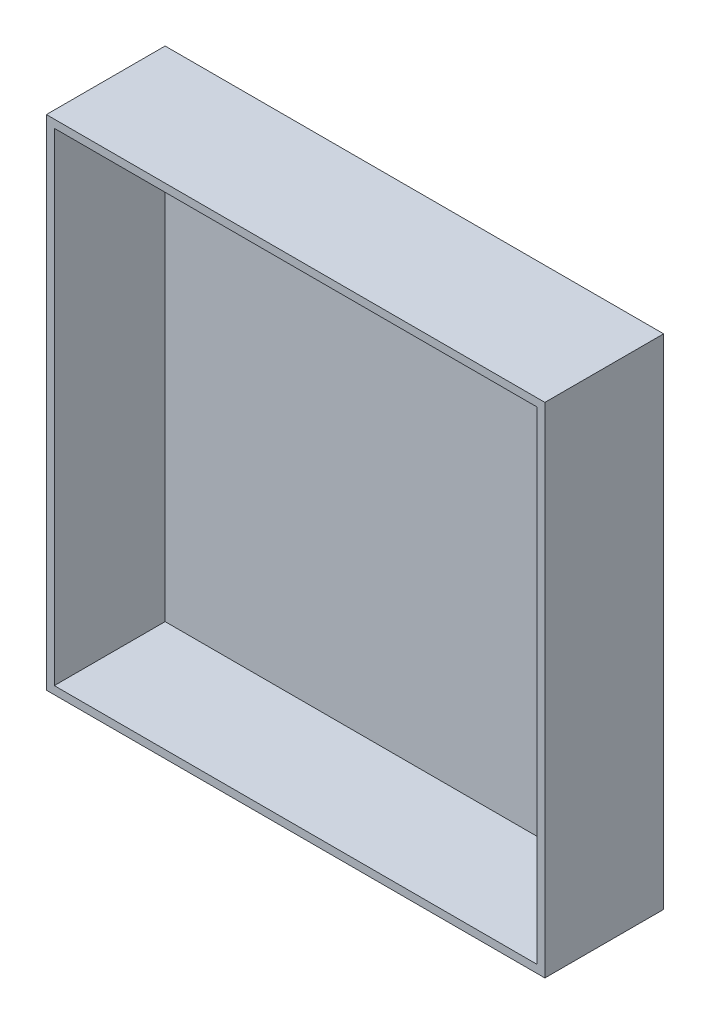
ISO-10303-21;
HEADER;
FILE_DESCRIPTION(('STEP AP214'),'2;1');
FILE_NAME('part.step','',(''),(''),'','','');
FILE_SCHEMA(('AUTOMOTIVE_DESIGN { 1 0 10303 214 1 1 1 1 }'));
ENDSEC;
DATA;
#1=APPLICATION_CONTEXT('core data for automotive mechanical design processes');
#2=APPLICATION_PROTOCOL_DEFINITION('international standard','automotive_design',2000,#1);
#3=PRODUCT_CONTEXT('',#1,'mechanical');
#4=PRODUCT('Part','Part','',(#3));
#5=PRODUCT_RELATED_PRODUCT_CATEGORY('part','',(#4));
#6=PRODUCT_DEFINITION_FORMATION('','',#4);
#7=PRODUCT_DEFINITION_CONTEXT('part definition',#1,'design');
#8=PRODUCT_DEFINITION('design','',#6,#7);
#9=PRODUCT_DEFINITION_SHAPE('','',#8);
#10=(LENGTH_UNIT() NAMED_UNIT(*) SI_UNIT(.MILLI.,.METRE.));
#11=(NAMED_UNIT(*) PLANE_ANGLE_UNIT() SI_UNIT($,.RADIAN.));
#12=(NAMED_UNIT(*) SI_UNIT($,.STERADIAN.) SOLID_ANGLE_UNIT());
#13=UNCERTAINTY_MEASURE_WITH_UNIT(LENGTH_MEASURE(1.E-05),#10,'distance_accuracy_value','');
#14=(GEOMETRIC_REPRESENTATION_CONTEXT(3) GLOBAL_UNCERTAINTY_ASSIGNED_CONTEXT((#13)) GLOBAL_UNIT_ASSIGNED_CONTEXT((#10,
#11,#12)) REPRESENTATION_CONTEXT('',''));
#15=CARTESIAN_POINT('',(0.,0.,0.));
#16=DIRECTION('',(0.,0.,1.));
#17=DIRECTION('',(1.,0.,0.));
#18=AXIS2_PLACEMENT_3D('',#15,#16,#17);
#19=CARTESIAN_POINT('',(0.,0.,9.));
#20=DIRECTION('',(0.,0.,1.));
#21=DIRECTION('',(1.,0.,0.));
#22=AXIS2_PLACEMENT_3D('',#19,#20,#21);
#23=PLANE('',#22);
#24=DIRECTION('',(0.,-1.,0.));
#25=VECTOR('',#24,1.);
#26=CARTESIAN_POINT('',(-1.61194056388099,0.,9.));
#27=LINE('',#26,#25);
#28=CARTESIAN_POINT('',(-1.61194056388099,1.2309398018795,9.));
#29=VERTEX_POINT('',#28);
#30=CARTESIAN_POINT('',(-1.61194056388099,-61.7390601981205,9.));
#31=VERTEX_POINT('',#30);
#32=EDGE_CURVE('E178',#29,#31,#27,.T.);
#33=ORIENTED_EDGE('',*,*,#32,.T.);
#34=DIRECTION('',(1.,0.,0.));
#35=VECTOR('',#34,1.);
#36=CARTESIAN_POINT('',(0.,-61.7390601981205,9.));
#37=LINE('',#36,#35);
#38=CARTESIAN_POINT('',(61.358059436119,-61.7390601981205,9.));
#39=VERTEX_POINT('',#38);
#40=EDGE_CURVE('E180',#31,#39,#37,.T.);
#41=ORIENTED_EDGE('',*,*,#40,.T.);
#42=DIRECTION('',(0.,1.,0.));
#43=VECTOR('',#42,1.);
#44=CARTESIAN_POINT('',(61.358059436119,0.,9.));
#45=LINE('',#44,#43);
#46=CARTESIAN_POINT('',(61.358059436119,1.2309398018795,9.));
#47=VERTEX_POINT('',#46);
#48=EDGE_CURVE('E130',#39,#47,#45,.T.);
#49=ORIENTED_EDGE('',*,*,#48,.T.);
#50=DIRECTION('',(-1.,0.,0.));
#51=VECTOR('',#50,1.);
#52=CARTESIAN_POINT('',(0.,1.2309398018795,9.));
#53=LINE('',#52,#51);
#54=EDGE_CURVE('E82',#47,#29,#53,.T.);
#55=ORIENTED_EDGE('',*,*,#54,.T.);
#56=EDGE_LOOP('',(#33,#41,#49,#55));
#57=FACE_BOUND('',#56,.T.);
#58=DIRECTION('',(1.,0.,0.));
#59=VECTOR('',#58,1.);
#60=CARTESIAN_POINT('',(-0.611940563880992,-60.7390601981205,9.));
#61=LINE('',#60,#59);
#62=CARTESIAN_POINT('',(-0.611940563880992,-60.7390601981205,9.));
#63=VERTEX_POINT('',#62);
#64=CARTESIAN_POINT('',(60.358059436119,-60.7390601981205,9.));
#65=VERTEX_POINT('',#64);
#66=EDGE_CURVE('E153',#63,#65,#61,.T.);
#67=ORIENTED_EDGE('',*,*,#66,.F.);
#68=DIRECTION('',(0.,-1.,0.));
#69=VECTOR('',#68,1.);
#70=CARTESIAN_POINT('',(-0.611940563880992,-60.7390601981205,9.));
#71=LINE('',#70,#69);
#72=CARTESIAN_POINT('',(-0.611940563880992,0.2309398018795,9.));
#73=VERTEX_POINT('',#72);
#74=EDGE_CURVE('E151',#73,#63,#71,.T.);
#75=ORIENTED_EDGE('',*,*,#74,.F.);
#76=DIRECTION('',(-1.,0.,0.));
#77=VECTOR('',#76,1.);
#78=CARTESIAN_POINT('',(-0.611940563880992,0.2309398018795,9.));
#79=LINE('',#78,#77);
#80=CARTESIAN_POINT('',(60.358059436119,0.230939801879497,9.));
#81=VERTEX_POINT('',#80);
#82=EDGE_CURVE('E158',#81,#73,#79,.T.);
#83=ORIENTED_EDGE('',*,*,#82,.F.);
#84=DIRECTION('',(0.,1.,0.));
#85=VECTOR('',#84,1.);
#86=CARTESIAN_POINT('',(60.358059436119,-60.7390601981205,9.));
#87=LINE('',#86,#85);
#88=EDGE_CURVE('E156',#65,#81,#87,.T.);
#89=ORIENTED_EDGE('',*,*,#88,.F.);
#90=EDGE_LOOP('',(#67,#75,#83,#89));
#91=FACE_BOUND('',#90,.T.);
#92=ADVANCED_FACE('F59',(#57,#91),#23,.T.);
#93=CARTESIAN_POINT('',(-1.61194056388099,0.,9.));
#94=DIRECTION('',(1.,0.,0.));
#95=DIRECTION('',(0.,0.,-1.));
#96=AXIS2_PLACEMENT_3D('',#93,#94,#95);
#97=PLANE('',#96);
#98=DIRECTION('',(0.,0.,-1.));
#99=VECTOR('',#98,1.);
#100=CARTESIAN_POINT('',(-1.61194056388099,1.2309398018795,9.));
#101=LINE('',#100,#99);
#102=CARTESIAN_POINT('',(-1.61194056388099,1.2309398018795,-6.));
#103=VERTEX_POINT('',#102);
#104=EDGE_CURVE('E184',#29,#103,#101,.T.);
#105=ORIENTED_EDGE('',*,*,#104,.T.);
#106=DIRECTION('',(0.,1.,0.));
#107=VECTOR('',#106,1.);
#108=CARTESIAN_POINT('',(-1.61194056388099,1.2309398018795,-6.));
#109=LINE('',#108,#107);
#110=CARTESIAN_POINT('',(-1.61194056388099,-61.7390601981205,-6.));
#111=VERTEX_POINT('',#110);
#112=EDGE_CURVE('E140',#111,#103,#109,.T.);
#113=ORIENTED_EDGE('',*,*,#112,.F.);
#114=DIRECTION('',(0.,0.,-1.));
#115=VECTOR('',#114,1.);
#116=CARTESIAN_POINT('',(-1.61194056388099,-61.7390601981205,9.));
#117=LINE('',#116,#115);
#118=EDGE_CURVE('E12',#31,#111,#117,.T.);
#119=ORIENTED_EDGE('',*,*,#118,.F.);
#120=ORIENTED_EDGE('',*,*,#32,.F.);
#121=EDGE_LOOP('',(#105,#113,#119,#120));
#122=FACE_BOUND('',#121,.T.);
#123=ADVANCED_FACE('F61',(#122),#97,.F.);
#124=CARTESIAN_POINT('',(0.,-61.7390601981205,9.));
#125=DIRECTION('',(0.,1.,0.));
#126=DIRECTION('',(0.,0.,1.));
#127=AXIS2_PLACEMENT_3D('',#124,#125,#126);
#128=PLANE('',#127);
#129=ORIENTED_EDGE('',*,*,#118,.T.);
#130=DIRECTION('',(-1.,0.,0.));
#131=VECTOR('',#130,1.);
#132=CARTESIAN_POINT('',(61.358059436119,-61.7390601981205,-6.));
#133=LINE('',#132,#131);
#134=CARTESIAN_POINT('',(61.358059436119,-61.7390601981205,-6.));
#135=VERTEX_POINT('',#134);
#136=EDGE_CURVE('E134',#135,#111,#133,.T.);
#137=ORIENTED_EDGE('',*,*,#136,.F.);
#138=DIRECTION('',(0.,0.,-1.));
#139=VECTOR('',#138,1.);
#140=CARTESIAN_POINT('',(61.358059436119,-61.7390601981205,9.));
#141=LINE('',#140,#139);
#142=EDGE_CURVE('E67',#39,#135,#141,.T.);
#143=ORIENTED_EDGE('',*,*,#142,.F.);
#144=ORIENTED_EDGE('',*,*,#40,.F.);
#145=EDGE_LOOP('',(#129,#137,#143,#144));
#146=FACE_BOUND('',#145,.T.);
#147=ADVANCED_FACE('F135',(#146),#128,.F.);
#148=CARTESIAN_POINT('',(61.358059436119,0.,9.));
#149=DIRECTION('',(-1.,0.,0.));
#150=DIRECTION('',(0.,0.,1.));
#151=AXIS2_PLACEMENT_3D('',#148,#149,#150);
#152=PLANE('',#151);
#153=ORIENTED_EDGE('',*,*,#142,.T.);
#154=DIRECTION('',(0.,-1.,0.));
#155=VECTOR('',#154,1.);
#156=CARTESIAN_POINT('',(61.358059436119,1.2309398018795,-6.));
#157=LINE('',#156,#155);
#158=CARTESIAN_POINT('',(61.358059436119,1.2309398018795,-6.));
#159=VERTEX_POINT('',#158);
#160=EDGE_CURVE('E129',#159,#135,#157,.T.);
#161=ORIENTED_EDGE('',*,*,#160,.F.);
#162=DIRECTION('',(0.,0.,-1.));
#163=VECTOR('',#162,1.);
#164=CARTESIAN_POINT('',(61.358059436119,1.2309398018795,9.));
#165=LINE('',#164,#163);
#166=EDGE_CURVE('E132',#47,#159,#165,.T.);
#167=ORIENTED_EDGE('',*,*,#166,.F.);
#168=ORIENTED_EDGE('',*,*,#48,.F.);
#169=EDGE_LOOP('',(#153,#161,#167,#168));
#170=FACE_BOUND('',#169,.T.);
#171=ADVANCED_FACE('F126',(#170),#152,.F.);
#172=CARTESIAN_POINT('',(0.,1.2309398018795,9.));
#173=DIRECTION('',(0.,-1.,0.));
#174=DIRECTION('',(1.,0.,0.));
#175=AXIS2_PLACEMENT_3D('',#172,#173,#174);
#176=PLANE('',#175);
#177=ORIENTED_EDGE('',*,*,#166,.T.);
#178=DIRECTION('',(1.,0.,0.));
#179=VECTOR('',#178,1.);
#180=CARTESIAN_POINT('',(61.358059436119,1.2309398018795,-6.));
#181=LINE('',#180,#179);
#182=EDGE_CURVE('E145',#103,#159,#181,.T.);
#183=ORIENTED_EDGE('',*,*,#182,.F.);
#184=ORIENTED_EDGE('',*,*,#104,.F.);
#185=ORIENTED_EDGE('',*,*,#54,.F.);
#186=EDGE_LOOP('',(#177,#183,#184,#185));
#187=FACE_BOUND('',#186,.T.);
#188=ADVANCED_FACE('F187',(#187),#176,.F.);
#189=CARTESIAN_POINT('',(-0.611940563880992,-60.7390601981205,9.));
#190=DIRECTION('',(1.,0.,0.));
#191=DIRECTION('',(0.,0.,-1.));
#192=AXIS2_PLACEMENT_3D('',#189,#190,#191);
#193=PLANE('',#192);
#194=DIRECTION('',(0.,-1.,0.));
#195=VECTOR('',#194,1.);
#196=CARTESIAN_POINT('',(-0.611940563880992,-60.7390601981205,-5.));
#197=LINE('',#196,#195);
#198=CARTESIAN_POINT('',(-0.611940563880992,0.2309398018795,-5.));
#199=VERTEX_POINT('',#198);
#200=CARTESIAN_POINT('',(-0.611940563880992,-60.7390601981205,-5.));
#201=VERTEX_POINT('',#200);
#202=EDGE_CURVE('E150',#199,#201,#197,.T.);
#203=ORIENTED_EDGE('',*,*,#202,.F.);
#204=DIRECTION('',(0.,0.,-1.));
#205=VECTOR('',#204,1.);
#206=CARTESIAN_POINT('',(-0.611940563880992,0.2309398018795,9.));
#207=LINE('',#206,#205);
#208=EDGE_CURVE('E160',#73,#199,#207,.T.);
#209=ORIENTED_EDGE('',*,*,#208,.F.);
#210=ORIENTED_EDGE('',*,*,#74,.T.);
#211=DIRECTION('',(0.,0.,-1.));
#212=VECTOR('',#211,1.);
#213=CARTESIAN_POINT('',(-0.611940563880992,-60.7390601981205,9.));
#214=LINE('',#213,#212);
#215=EDGE_CURVE('E175',#63,#201,#214,.T.);
#216=ORIENTED_EDGE('',*,*,#215,.T.);
#217=EDGE_LOOP('',(#203,#209,#210,#216));
#218=FACE_BOUND('',#217,.T.);
#219=ADVANCED_FACE('F208',(#218),#193,.T.);
#220=CARTESIAN_POINT('',(-0.611940563880992,-60.7390601981205,9.));
#221=DIRECTION('',(0.,1.,0.));
#222=DIRECTION('',(0.,0.,1.));
#223=AXIS2_PLACEMENT_3D('',#220,#221,#222);
#224=PLANE('',#223);
#225=DIRECTION('',(1.,0.,0.));
#226=VECTOR('',#225,1.);
#227=CARTESIAN_POINT('',(-0.611940563880992,-60.7390601981205,-5.));
#228=LINE('',#227,#226);
#229=CARTESIAN_POINT('',(60.358059436119,-60.7390601981205,-5.));
#230=VERTEX_POINT('',#229);
#231=EDGE_CURVE('E163',#201,#230,#228,.T.);
#232=ORIENTED_EDGE('',*,*,#231,.F.);
#233=ORIENTED_EDGE('',*,*,#215,.F.);
#234=ORIENTED_EDGE('',*,*,#66,.T.);
#235=DIRECTION('',(0.,0.,-1.));
#236=VECTOR('',#235,1.);
#237=CARTESIAN_POINT('',(60.358059436119,-60.7390601981205,9.));
#238=LINE('',#237,#236);
#239=EDGE_CURVE('E173',#65,#230,#238,.T.);
#240=ORIENTED_EDGE('',*,*,#239,.T.);
#241=EDGE_LOOP('',(#232,#233,#234,#240));
#242=FACE_BOUND('',#241,.T.);
#243=ADVANCED_FACE('F200',(#242),#224,.T.);
#244=CARTESIAN_POINT('',(60.358059436119,-60.7390601981205,9.));
#245=DIRECTION('',(-1.,0.,0.));
#246=DIRECTION('',(0.,0.,1.));
#247=AXIS2_PLACEMENT_3D('',#244,#245,#246);
#248=PLANE('',#247);
#249=DIRECTION('',(0.,1.,0.));
#250=VECTOR('',#249,1.);
#251=CARTESIAN_POINT('',(60.358059436119,-60.7390601981205,-5.));
#252=LINE('',#251,#250);
#253=CARTESIAN_POINT('',(60.358059436119,0.230939801879497,-5.));
#254=VERTEX_POINT('',#253);
#255=EDGE_CURVE('E166',#230,#254,#252,.T.);
#256=ORIENTED_EDGE('',*,*,#255,.F.);
#257=ORIENTED_EDGE('',*,*,#239,.F.);
#258=ORIENTED_EDGE('',*,*,#88,.T.);
#259=DIRECTION('',(0.,0.,-1.));
#260=VECTOR('',#259,1.);
#261=CARTESIAN_POINT('',(60.358059436119,0.230939801879497,9.));
#262=LINE('',#261,#260);
#263=EDGE_CURVE('E74',#81,#254,#262,.T.);
#264=ORIENTED_EDGE('',*,*,#263,.T.);
#265=EDGE_LOOP('',(#256,#257,#258,#264));
#266=FACE_BOUND('',#265,.T.);
#267=ADVANCED_FACE('F203',(#266),#248,.T.);
#268=CARTESIAN_POINT('',(-0.611940563880992,0.2309398018795,9.));
#269=DIRECTION('',(0.,-1.,0.));
#270=DIRECTION('',(1.,0.,0.));
#271=AXIS2_PLACEMENT_3D('',#268,#269,#270);
#272=PLANE('',#271);
#273=DIRECTION('',(-1.,0.,0.));
#274=VECTOR('',#273,1.);
#275=CARTESIAN_POINT('',(-0.611940563880992,0.2309398018795,-5.));
#276=LINE('',#275,#274);
#277=EDGE_CURVE('E154',#254,#199,#276,.T.);
#278=ORIENTED_EDGE('',*,*,#277,.F.);
#279=ORIENTED_EDGE('',*,*,#263,.F.);
#280=ORIENTED_EDGE('',*,*,#82,.T.);
#281=ORIENTED_EDGE('',*,*,#208,.T.);
#282=EDGE_LOOP('',(#278,#279,#280,#281));
#283=FACE_BOUND('',#282,.T.);
#284=ADVANCED_FACE('F210',(#283),#272,.T.);
#285=CARTESIAN_POINT('',(0.,0.,-5.));
#286=DIRECTION('',(0.,0.,-1.));
#287=DIRECTION('',(-1.,0.,0.));
#288=AXIS2_PLACEMENT_3D('',#285,#286,#287);
#289=PLANE('',#288);
#290=ORIENTED_EDGE('',*,*,#277,.T.);
#291=ORIENTED_EDGE('',*,*,#202,.T.);
#292=ORIENTED_EDGE('',*,*,#231,.T.);
#293=ORIENTED_EDGE('',*,*,#255,.T.);
#294=EDGE_LOOP('',(#290,#291,#292,#293));
#295=FACE_BOUND('',#294,.T.);
#296=ADVANCED_FACE('F205',(#295),#289,.F.);
#297=CARTESIAN_POINT('',(0.,0.,-6.));
#298=DIRECTION('',(0.,0.,-1.));
#299=DIRECTION('',(-1.,0.,0.));
#300=AXIS2_PLACEMENT_3D('',#297,#298,#299);
#301=PLANE('',#300);
#302=ORIENTED_EDGE('',*,*,#160,.T.);
#303=ORIENTED_EDGE('',*,*,#136,.T.);
#304=ORIENTED_EDGE('',*,*,#112,.T.);
#305=ORIENTED_EDGE('',*,*,#182,.T.);
#306=EDGE_LOOP('',(#302,#303,#304,#305));
#307=FACE_BOUND('',#306,.T.);
#308=ADVANCED_FACE('F143',(#307),#301,.T.);
#309=CLOSED_SHELL('',(#92,#123,#147,#171,#188,#219,#243,#267,#284,#296,#308));
#310=MANIFOLD_SOLID_BREP('B2',#309);
#311=ADVANCED_BREP_SHAPE_REPRESENTATION('',(#18,#310),#14);
#312=SHAPE_DEFINITION_REPRESENTATION(#9,#311);
ENDSEC;
END-ISO-10303-21;
